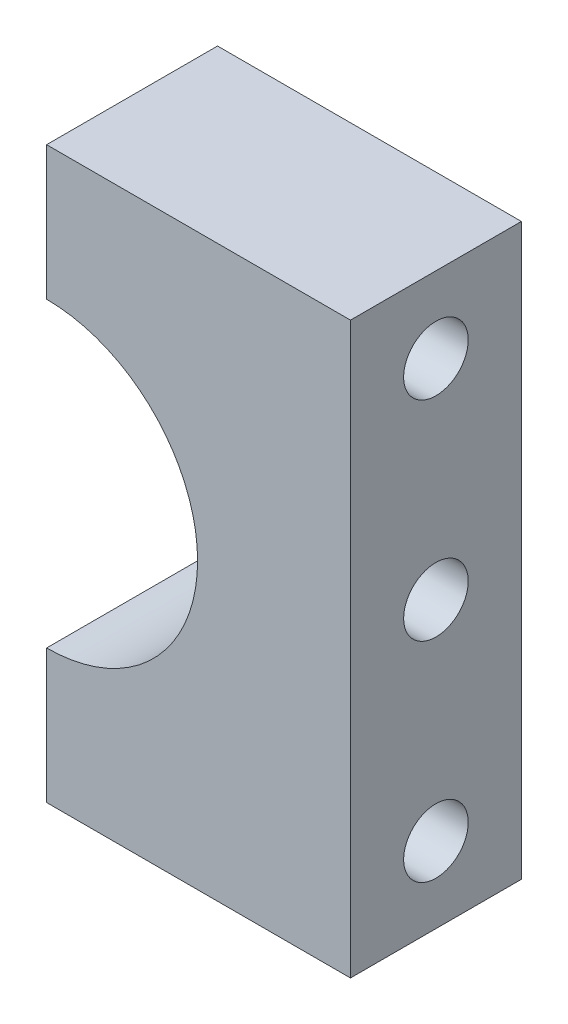
ISO-10303-21;
HEADER;
FILE_DESCRIPTION(('STEP AP214'),'2;1');
FILE_NAME('part.step','',(''),(''),'','','');
FILE_SCHEMA(('AUTOMOTIVE_DESIGN { 1 0 10303 214 1 1 1 1 }'));
ENDSEC;
DATA;
#1=APPLICATION_CONTEXT('core data for automotive mechanical design processes');
#2=APPLICATION_PROTOCOL_DEFINITION('international standard','automotive_design',2000,#1);
#3=PRODUCT_CONTEXT('',#1,'mechanical');
#4=PRODUCT('Part','Part','',(#3));
#5=PRODUCT_RELATED_PRODUCT_CATEGORY('part','',(#4));
#6=PRODUCT_DEFINITION_FORMATION('','',#4);
#7=PRODUCT_DEFINITION_CONTEXT('part definition',#1,'design');
#8=PRODUCT_DEFINITION('design','',#6,#7);
#9=PRODUCT_DEFINITION_SHAPE('','',#8);
#10=(LENGTH_UNIT() NAMED_UNIT(*) SI_UNIT(.MILLI.,.METRE.));
#11=(NAMED_UNIT(*) PLANE_ANGLE_UNIT() SI_UNIT($,.RADIAN.));
#12=(NAMED_UNIT(*) SI_UNIT($,.STERADIAN.) SOLID_ANGLE_UNIT());
#13=UNCERTAINTY_MEASURE_WITH_UNIT(LENGTH_MEASURE(1.E-05),#10,'distance_accuracy_value','');
#14=(GEOMETRIC_REPRESENTATION_CONTEXT(3) GLOBAL_UNCERTAINTY_ASSIGNED_CONTEXT((#13)) GLOBAL_UNIT_ASSIGNED_CONTEXT((#10,
#11,#12)) REPRESENTATION_CONTEXT('',''));
#15=CARTESIAN_POINT('',(0.,0.,0.));
#16=DIRECTION('',(0.,0.,1.));
#17=DIRECTION('',(1.,0.,0.));
#18=AXIS2_PLACEMENT_3D('',#15,#16,#17);
#19=CARTESIAN_POINT('',(31.5,12.,9.));
#20=DIRECTION('',(0.,0.,1.));
#21=DIRECTION('',(1.,0.,0.));
#22=AXIS2_PLACEMENT_3D('',#19,#20,#21);
#23=PLANE('',#22);
#24=DIRECTION('',(0.,1.,0.));
#25=VECTOR('',#24,1.);
#26=CARTESIAN_POINT('',(32.,8.,9.));
#27=LINE('',#26,#25);
#28=CARTESIAN_POINT('',(32.,0.,9.));
#29=VERTEX_POINT('',#28);
#30=CARTESIAN_POINT('',(32.,30.,9.));
#31=VERTEX_POINT('',#30);
#32=EDGE_CURVE('E123',#29,#31,#27,.T.);
#33=ORIENTED_EDGE('',*,*,#32,.T.);
#34=DIRECTION('',(-1.,0.,0.));
#35=VECTOR('',#34,1.);
#36=CARTESIAN_POINT('',(0.,30.,9.));
#37=LINE('',#36,#35);
#38=CARTESIAN_POINT('',(16.,30.,9.));
#39=VERTEX_POINT('',#38);
#40=EDGE_CURVE('E129',#31,#39,#37,.T.);
#41=ORIENTED_EDGE('',*,*,#40,.T.);
#42=DIRECTION('',(0.,1.,0.));
#43=VECTOR('',#42,1.);
#44=CARTESIAN_POINT('',(16.,12.,9.));
#45=LINE('',#44,#43);
#46=CARTESIAN_POINT('',(16.,22.95,9.));
#47=VERTEX_POINT('',#46);
#48=EDGE_CURVE('E100',#47,#39,#45,.T.);
#49=ORIENTED_EDGE('',*,*,#48,.F.);
#50=CARTESIAN_POINT('',(16.,15.,9.));
#51=DIRECTION('',(0.,0.,1.));
#52=DIRECTION('',(1.,0.,0.));
#53=AXIS2_PLACEMENT_3D('',#50,#51,#52);
#54=CIRCLE('',#53,7.95);
#55=CARTESIAN_POINT('',(16.,7.05,9.));
#56=VERTEX_POINT('',#55);
#57=EDGE_CURVE('E190',#56,#47,#54,.T.);
#58=ORIENTED_EDGE('',*,*,#57,.F.);
#59=CARTESIAN_POINT('',(16.,0.,9.));
#60=VERTEX_POINT('',#59);
#61=EDGE_CURVE('E68',#60,#56,#45,.T.);
#62=ORIENTED_EDGE('',*,*,#61,.F.);
#63=DIRECTION('',(1.,0.,0.));
#64=VECTOR('',#63,1.);
#65=CARTESIAN_POINT('',(0.,0.,9.));
#66=LINE('',#65,#64);
#67=EDGE_CURVE('E120',#60,#29,#66,.T.);
#68=ORIENTED_EDGE('',*,*,#67,.T.);
#69=EDGE_LOOP('',(#33,#41,#49,#58,#62,#68));
#70=FACE_BOUND('',#69,.T.);
#71=ADVANCED_FACE('F43',(#70),#23,.T.);
#72=CARTESIAN_POINT('',(31.5,12.,0.));
#73=DIRECTION('',(0.,0.,1.));
#74=DIRECTION('',(1.,0.,0.));
#75=AXIS2_PLACEMENT_3D('',#72,#73,#74);
#76=PLANE('',#75);
#77=DIRECTION('',(0.,1.,0.));
#78=VECTOR('',#77,1.);
#79=CARTESIAN_POINT('',(32.,30.,0.));
#80=LINE('',#79,#78);
#81=CARTESIAN_POINT('',(32.,0.,0.));
#82=VERTEX_POINT('',#81);
#83=CARTESIAN_POINT('',(32.,30.,0.));
#84=VERTEX_POINT('',#83);
#85=EDGE_CURVE('E121',#82,#84,#80,.T.);
#86=ORIENTED_EDGE('',*,*,#85,.F.);
#87=DIRECTION('',(1.,0.,0.));
#88=VECTOR('',#87,1.);
#89=CARTESIAN_POINT('',(0.,0.,0.));
#90=LINE('',#89,#88);
#91=CARTESIAN_POINT('',(16.,0.,0.));
#92=VERTEX_POINT('',#91);
#93=EDGE_CURVE('E125',#92,#82,#90,.T.);
#94=ORIENTED_EDGE('',*,*,#93,.F.);
#95=DIRECTION('',(0.,-1.,0.));
#96=VECTOR('',#95,1.);
#97=CARTESIAN_POINT('',(16.,30.,0.));
#98=LINE('',#97,#96);
#99=CARTESIAN_POINT('',(16.,7.05,0.));
#100=VERTEX_POINT('',#99);
#101=EDGE_CURVE('E115',#100,#92,#98,.T.);
#102=ORIENTED_EDGE('',*,*,#101,.F.);
#103=CARTESIAN_POINT('',(16.,15.,0.));
#104=DIRECTION('',(0.,0.,1.));
#105=DIRECTION('',(1.,0.,0.));
#106=AXIS2_PLACEMENT_3D('',#103,#104,#105);
#107=CIRCLE('',#106,7.95);
#108=CARTESIAN_POINT('',(16.,22.95,0.));
#109=VERTEX_POINT('',#108);
#110=EDGE_CURVE('E114',#100,#109,#107,.T.);
#111=ORIENTED_EDGE('',*,*,#110,.T.);
#112=CARTESIAN_POINT('',(16.,30.,0.));
#113=VERTEX_POINT('',#112);
#114=EDGE_CURVE('E60',#113,#109,#98,.T.);
#115=ORIENTED_EDGE('',*,*,#114,.F.);
#116=DIRECTION('',(-1.,0.,0.));
#117=VECTOR('',#116,1.);
#118=CARTESIAN_POINT('',(0.,30.,0.));
#119=LINE('',#118,#117);
#120=EDGE_CURVE('E111',#84,#113,#119,.T.);
#121=ORIENTED_EDGE('',*,*,#120,.F.);
#122=EDGE_LOOP('',(#86,#94,#102,#111,#115,#121));
#123=FACE_BOUND('',#122,.T.);
#124=ADVANCED_FACE('F110',(#123),#76,.F.);
#125=CARTESIAN_POINT('',(0.,0.,9.));
#126=DIRECTION('',(0.,1.,0.));
#127=DIRECTION('',(-1.,0.,0.));
#128=AXIS2_PLACEMENT_3D('',#125,#126,#127);
#129=PLANE('',#128);
#130=ORIENTED_EDGE('',*,*,#67,.F.);
#131=DIRECTION('',(0.,0.,-1.));
#132=VECTOR('',#131,1.);
#133=CARTESIAN_POINT('',(16.,0.,10.));
#134=LINE('',#133,#132);
#135=EDGE_CURVE('E105',#60,#92,#134,.T.);
#136=ORIENTED_EDGE('',*,*,#135,.T.);
#137=ORIENTED_EDGE('',*,*,#93,.T.);
#138=DIRECTION('',(0.,0.,-1.));
#139=VECTOR('',#138,1.);
#140=CARTESIAN_POINT('',(32.,0.,9.));
#141=LINE('',#140,#139);
#142=EDGE_CURVE('E11',#29,#82,#141,.T.);
#143=ORIENTED_EDGE('',*,*,#142,.F.);
#144=EDGE_LOOP('',(#130,#136,#137,#143));
#145=FACE_BOUND('',#144,.T.);
#146=ADVANCED_FACE('F45',(#145),#129,.F.);
#147=CARTESIAN_POINT('',(32.,30.,9.));
#148=DIRECTION('',(-1.,0.,0.));
#149=DIRECTION('',(0.,0.,1.));
#150=AXIS2_PLACEMENT_3D('',#147,#148,#149);
#151=PLANE('',#150);
#152=CARTESIAN_POINT('',(32.,15.,4.5));
#153=DIRECTION('',(-1.,0.,0.));
#154=DIRECTION('',(0.,0.,1.));
#155=AXIS2_PLACEMENT_3D('',#152,#153,#154);
#156=CIRCLE('',#155,1.7);
#157=CARTESIAN_POINT('',(32.,15.,6.2));
#158=VERTEX_POINT('',#157);
#159=EDGE_CURVE('E47',#158,#158,#156,.T.);
#160=ORIENTED_EDGE('',*,*,#159,.T.);
#161=EDGE_LOOP('',(#160));
#162=FACE_BOUND('',#161,.T.);
#163=CARTESIAN_POINT('',(32.,26.,4.5));
#164=DIRECTION('',(1.,0.,0.));
#165=DIRECTION('',(0.,0.,-1.));
#166=AXIS2_PLACEMENT_3D('',#163,#164,#165);
#167=CIRCLE('',#166,1.7);
#168=CARTESIAN_POINT('',(32.,26.,2.8));
#169=VERTEX_POINT('',#168);
#170=EDGE_CURVE('E138',#169,#169,#167,.T.);
#171=ORIENTED_EDGE('',*,*,#170,.F.);
#172=EDGE_LOOP('',(#171));
#173=FACE_BOUND('',#172,.T.);
#174=ORIENTED_EDGE('',*,*,#85,.T.);
#175=DIRECTION('',(0.,0.,-1.));
#176=VECTOR('',#175,1.);
#177=CARTESIAN_POINT('',(32.,30.,9.));
#178=LINE('',#177,#176);
#179=EDGE_CURVE('E52',#31,#84,#178,.T.);
#180=ORIENTED_EDGE('',*,*,#179,.F.);
#181=ORIENTED_EDGE('',*,*,#32,.F.);
#182=ORIENTED_EDGE('',*,*,#142,.T.);
#183=EDGE_LOOP('',(#174,#180,#181,#182));
#184=FACE_BOUND('',#183,.T.);
#185=CARTESIAN_POINT('',(32.,4.,4.5));
#186=DIRECTION('',(1.,0.,0.));
#187=DIRECTION('',(0.,0.,-1.));
#188=AXIS2_PLACEMENT_3D('',#185,#186,#187);
#189=CIRCLE('',#188,1.7);
#190=CARTESIAN_POINT('',(32.,4.,2.8));
#191=VERTEX_POINT('',#190);
#192=EDGE_CURVE('E187',#191,#191,#189,.T.);
#193=ORIENTED_EDGE('',*,*,#192,.F.);
#194=EDGE_LOOP('',(#193));
#195=FACE_BOUND('',#194,.T.);
#196=ADVANCED_FACE('F171',(#162,#173,#184,#195),#151,.F.);
#197=CARTESIAN_POINT('',(0.,30.,9.));
#198=DIRECTION('',(0.,-1.,0.));
#199=DIRECTION('',(0.,0.,-1.));
#200=AXIS2_PLACEMENT_3D('',#197,#198,#199);
#201=PLANE('',#200);
#202=ORIENTED_EDGE('',*,*,#120,.T.);
#203=DIRECTION('',(0.,0.,-1.));
#204=VECTOR('',#203,1.);
#205=CARTESIAN_POINT('',(16.,30.,10.));
#206=LINE('',#205,#204);
#207=EDGE_CURVE('E96',#39,#113,#206,.T.);
#208=ORIENTED_EDGE('',*,*,#207,.F.);
#209=ORIENTED_EDGE('',*,*,#40,.F.);
#210=ORIENTED_EDGE('',*,*,#179,.T.);
#211=EDGE_LOOP('',(#202,#208,#209,#210));
#212=FACE_BOUND('',#211,.T.);
#213=ADVANCED_FACE('F118',(#212),#201,.F.);
#214=CARTESIAN_POINT('',(16.,15.,9.));
#215=DIRECTION('',(0.,0.,-1.));
#216=DIRECTION('',(-1.,0.,0.));
#217=AXIS2_PLACEMENT_3D('',#214,#215,#216);
#218=CYLINDRICAL_SURFACE('',#217,7.95);
#219=DIRECTION('',(0.,0.,-1.));
#220=VECTOR('',#219,1.);
#221=CARTESIAN_POINT('',(16.,7.05,9.));
#222=LINE('',#221,#220);
#223=EDGE_CURVE('E194',#56,#100,#222,.T.);
#224=ORIENTED_EDGE('',*,*,#223,.F.);
#225=ORIENTED_EDGE('',*,*,#57,.T.);
#226=DIRECTION('',(0.,0.,-1.));
#227=VECTOR('',#226,1.);
#228=CARTESIAN_POINT('',(16.,22.95,9.));
#229=LINE('',#228,#227);
#230=EDGE_CURVE('E208',#109,#47,#229,.F.);
#231=ORIENTED_EDGE('',*,*,#230,.F.);
#232=ORIENTED_EDGE('',*,*,#110,.F.);
#233=EDGE_LOOP('',(#224,#225,#231,#232));
#234=FACE_BOUND('',#233,.T.);
#235=CARTESIAN_POINT('',(23.7661122835045,13.3,4.5));
#236=CARTESIAN_POINT('',(23.7661141872229,13.3000033129941,4.5943109642859));
#237=CARTESIAN_POINT('',(23.7678489419856,13.3078748219172,4.68866224997616));
#238=CARTESIAN_POINT('',(23.7745884659118,13.3391206437132,4.87468543010844));
#239=CARTESIAN_POINT('',(23.7795956669418,13.3625064860114,4.96635527891183));
#240=CARTESIAN_POINT('',(23.7922876489716,13.4240140896177,5.14429768292524));
#241=CARTESIAN_POINT('',(23.7999695654145,13.4621200907434,5.23057589631724));
#242=CARTESIAN_POINT('',(23.817141984316,13.551941724182,5.39551547711853));
#243=CARTESIAN_POINT('',(23.8266324324992,13.6036569480899,5.47417707300121));
#244=CARTESIAN_POINT('',(23.8465238206736,13.7201193105937,5.62292290460992));
#245=CARTESIAN_POINT('',(23.8569359681267,13.7850445514897,5.69286621808963));
#246=CARTESIAN_POINT('',(23.877399311524,13.9256993882072,5.82095690426707));
#247=CARTESIAN_POINT('',(23.8874504801263,14.001429800299,5.87910338497535));
#248=CARTESIAN_POINT('',(23.9061811137769,14.1624869983143,5.9825044411356));
#249=CARTESIAN_POINT('',(23.9148458148636,14.2479023896894,6.02762390927777));
#250=CARTESIAN_POINT('',(23.929700826949,14.4253189099216,6.10281667964285));
#251=CARTESIAN_POINT('',(23.9358914031206,14.5173193317579,6.13289159440613));
#252=CARTESIAN_POINT('',(23.945021461709,14.7038298020327,6.17669953228088));
#253=CARTESIAN_POINT('',(23.9480083183567,14.7982815047663,6.19067092045913));
#254=CARTESIAN_POINT('',(23.9505583976698,14.9882322496347,6.20262005194222));
#255=CARTESIAN_POINT('',(23.9501219953826,15.0837311758922,6.20059954729629));
#256=CARTESIAN_POINT('',(23.9459110689087,15.2714237107685,6.18080065608652));
#257=CARTESIAN_POINT('',(23.9421909640677,15.3636458166694,6.16327915009655));
#258=CARTESIAN_POINT('',(23.9318924561479,15.5438097301951,6.11338446257168));
#259=CARTESIAN_POINT('',(23.9253139276535,15.6317513498222,6.08101062937617));
#260=CARTESIAN_POINT('',(23.9099496370436,15.8015763523485,6.00210016085132));
#261=CARTESIAN_POINT('',(23.9011486393898,15.8834126485471,5.95546527703628));
#262=CARTESIAN_POINT('',(23.8823058403426,16.0381920690372,5.84942960691174));
#263=CARTESIAN_POINT('',(23.8722638769955,16.1111340300909,5.79002715360728));
#264=CARTESIAN_POINT('',(23.8518089034424,16.2475811659534,5.6587411198786));
#265=CARTESIAN_POINT('',(23.8413924860665,16.3108696868057,5.58663270853256));
#266=CARTESIAN_POINT('',(23.8215504221431,16.4244949066272,5.43271880643315));
#267=CARTESIAN_POINT('',(23.8121248001113,16.4748312851615,5.35091307584214));
#268=CARTESIAN_POINT('',(23.7953231174405,16.5612137684422,5.17958700288325));
#269=CARTESIAN_POINT('',(23.787952717816,16.597220517038,5.0900462250085));
#270=CARTESIAN_POINT('',(23.7761755571917,16.6536118471267,4.90599039132229));
#271=CARTESIAN_POINT('',(23.7717683489746,16.6739987860924,4.81147608845906));
#272=CARTESIAN_POINT('',(23.7665073597396,16.698239045832,4.62213146348638));
#273=CARTESIAN_POINT('',(23.7655859389165,16.7024071308708,4.5273432710068));
#274=CARTESIAN_POINT('',(23.7672186316109,16.6949421602401,4.3384263511766));
#275=CARTESIAN_POINT('',(23.7697725177244,16.6833101384381,4.24429758108228));
#276=CARTESIAN_POINT('',(23.7780043345222,16.6448477838284,4.06045719752228));
#277=CARTESIAN_POINT('',(23.7836468967096,16.618189417141,3.97070787674854));
#278=CARTESIAN_POINT('',(23.7973886260018,16.5506166750185,3.79694965839947));
#279=CARTESIAN_POINT('',(23.8054880196023,16.5097009851468,3.71294129095886));
#280=CARTESIAN_POINT('',(23.8233803245948,16.4140764565133,3.55168342787885));
#281=CARTESIAN_POINT('',(23.8331964736278,16.3591728941945,3.47455203210251));
#282=CARTESIAN_POINT('',(23.8533543159628,16.2373872007273,3.33048198321197));
#283=CARTESIAN_POINT('',(23.8636960713997,16.1705036509874,3.26354453893736));
#284=CARTESIAN_POINT('',(23.8839619155484,16.0252352264966,3.14054839011173));
#285=CARTESIAN_POINT('',(23.8938753360673,15.9466673186512,3.08470381033189));
#286=CARTESIAN_POINT('',(23.9119742332038,15.7810824887388,2.98700648350742));
#287=CARTESIAN_POINT('',(23.9201597885231,15.6940659517579,2.94515309913411));
#288=CARTESIAN_POINT('',(23.9338355232488,15.5145833219385,2.87692819313777));
#289=CARTESIAN_POINT('',(23.9393422965235,15.4221548581953,2.85046115527808));
#290=CARTESIAN_POINT('',(23.9471116001215,15.2340330667252,2.81346069695955));
#291=CARTESIAN_POINT('',(23.9493745801283,15.1383401934234,2.80292506793601));
#292=CARTESIAN_POINT('',(23.9503886997825,14.9484419851733,2.79818210875684));
#293=CARTESIAN_POINT('',(23.9492087260198,14.8542448738561,2.80365449594761));
#294=CARTESIAN_POINT('',(23.9436163686276,14.6681459645559,2.83005830763286));
#295=CARTESIAN_POINT('',(23.9392040381796,14.5762441288348,2.85098947778661));
#296=CARTESIAN_POINT('',(23.9276469967434,14.3975793459462,2.90756612109258));
#297=CARTESIAN_POINT('',(23.9205103813584,14.3108020443623,2.94316802274452));
#298=CARTESIAN_POINT('',(23.9042685262305,14.1444091254304,3.02803230238845));
#299=CARTESIAN_POINT('',(23.8951631046538,14.0647941705408,3.07729594226213));
#300=CARTESIAN_POINT('',(23.8757714023852,13.9134177712811,3.18913936409738));
#301=CARTESIAN_POINT('',(23.8654666263221,13.8418258833761,3.25194545060346));
#302=CARTESIAN_POINT('',(23.8449399332437,13.7100879787366,3.38863210693912));
#303=CARTESIAN_POINT('',(23.8347180366844,13.6499447100315,3.4625153280415));
#304=CARTESIAN_POINT('',(23.8153707606138,13.5420806944262,3.62038265628356));
#305=CARTESIAN_POINT('',(23.8062608918763,13.4945267588879,3.70448274155578));
#306=CARTESIAN_POINT('',(23.790362556418,13.4143024293156,3.87965602416482));
#307=CARTESIAN_POINT('',(23.7835720878836,13.3816191926377,3.97072312492864));
#308=CARTESIAN_POINT('',(23.7743640324293,13.3380354783044,4.1349290023104));
#309=CARTESIAN_POINT('',(23.7712897915581,13.32379902437,4.20716405921238));
#310=CARTESIAN_POINT('',(23.767163219817,13.3047802039907,4.35292460812472));
#311=CARTESIAN_POINT('',(23.7661107988585,13.299997416307,4.42645004249084));
#312=CARTESIAN_POINT('',(23.7661122835045,13.3,4.5));
#313=B_SPLINE_CURVE_WITH_KNOTS('',3,(#235,#236,#237,#238,#239,#240,#241,#242,#243,#244,#245,
#246,#247,#248,#249,#250,#251,#252,#253,#254,#255,#256,#257,#258,#259,#260,#261,#262,#263,#264,
#265,#266,#267,#268,#269,#270,#271,#272,#273,#274,#275,#276,#277,#278,#279,#280,#281,#282,#283,
#284,#285,#286,#287,#288,#289,#290,#291,#292,#293,#294,#295,#296,#297,#298,#299,#300,#301,#302,
#303,#304,#305,#306,#307,#308,#309,#310,#311,#312),.UNSPECIFIED.,.T.,.F.,(4,2,2,2,2,2,2,2,2,2,2,
2,2,2,2,2,2,2,2,2,2,2,2,2,2,2,2,2,2,2,2,2,2,2,2,2,2,2,4),(0.,0.282663408166271,
0.565537112366904,0.848108792655945,1.13067199409935,1.41733267223707,1.70401501746845,
1.99357180597698,2.28309755188179,2.56828034506872,2.8534318944632,3.13394465920556,
3.41446973290136,3.69697270875964,3.97951259198858,4.26767447313142,4.55584348268647,
4.84479857142277,5.13371004003603,5.41698570023714,5.70024282541303,5.98032223194158,
6.26042746688797,6.54466817847692,6.82894257026549,7.11826149555369,7.40756723995364,
7.69505729000225,7.98250748176797,8.26424605630019,8.54597999553865,8.82688315852989,
9.10781227610188,9.39386085874022,9.67997801571251,9.96971542029072,10.2592021244673,
10.4796516579891,10.7000913684453),.UNSPECIFIED.);
#314=CARTESIAN_POINT('',(23.7661122835045,13.3,4.5));
#315=VERTEX_POINT('',#314);
#316=EDGE_CURVE('E131',#315,#315,#313,.T.);
#317=ORIENTED_EDGE('',*,*,#316,.F.);
#318=EDGE_LOOP('',(#317));
#319=FACE_BOUND('',#318,.T.);
#320=ADVANCED_FACE('F140',(#234,#319),#218,.F.);
#321=CARTESIAN_POINT('',(-18.,26.,4.5));
#322=DIRECTION('',(1.,0.,0.));
#323=DIRECTION('',(0.,0.,-1.));
#324=AXIS2_PLACEMENT_3D('',#321,#322,#323);
#325=CYLINDRICAL_SURFACE('',#324,1.7);
#326=CARTESIAN_POINT('',(16.,26.,4.5));
#327=DIRECTION('',(1.,0.,0.));
#328=DIRECTION('',(0.,1.,0.));
#329=AXIS2_PLACEMENT_3D('',#326,#327,#328);
#330=CIRCLE('',#329,1.7);
#331=CARTESIAN_POINT('',(16.,27.7,4.5));
#332=VERTEX_POINT('',#331);
#333=EDGE_CURVE('E209',#332,#332,#330,.F.);
#334=ORIENTED_EDGE('',*,*,#333,.T.);
#335=EDGE_LOOP('',(#334));
#336=FACE_BOUND('',#335,.T.);
#337=ORIENTED_EDGE('',*,*,#170,.T.);
#338=EDGE_LOOP('',(#337));
#339=FACE_BOUND('',#338,.T.);
#340=ADVANCED_FACE('F153',(#336,#339),#325,.F.);
#341=CARTESIAN_POINT('',(-18.,4.,4.5));
#342=DIRECTION('',(1.,0.,0.));
#343=DIRECTION('',(0.,0.,-1.));
#344=AXIS2_PLACEMENT_3D('',#341,#342,#343);
#345=CYLINDRICAL_SURFACE('',#344,1.7);
#346=CARTESIAN_POINT('',(16.,4.,4.5));
#347=DIRECTION('',(1.,0.,0.));
#348=DIRECTION('',(0.,1.,0.));
#349=AXIS2_PLACEMENT_3D('',#346,#347,#348);
#350=CIRCLE('',#349,1.7);
#351=CARTESIAN_POINT('',(16.,5.7,4.5));
#352=VERTEX_POINT('',#351);
#353=EDGE_CURVE('E139',#352,#352,#350,.F.);
#354=ORIENTED_EDGE('',*,*,#353,.T.);
#355=EDGE_LOOP('',(#354));
#356=FACE_BOUND('',#355,.T.);
#357=ORIENTED_EDGE('',*,*,#192,.T.);
#358=EDGE_LOOP('',(#357));
#359=FACE_BOUND('',#358,.T.);
#360=ADVANCED_FACE('F150',(#356,#359),#345,.F.);
#361=CARTESIAN_POINT('',(33.5,15.,4.5));
#362=DIRECTION('',(-1.,0.,0.));
#363=DIRECTION('',(0.,-1.,0.));
#364=AXIS2_PLACEMENT_3D('',#361,#362,#363);
#365=CYLINDRICAL_SURFACE('',#364,1.7);
#366=ORIENTED_EDGE('',*,*,#316,.T.);
#367=EDGE_LOOP('',(#366));
#368=FACE_BOUND('',#367,.T.);
#369=ORIENTED_EDGE('',*,*,#159,.F.);
#370=EDGE_LOOP('',(#369));
#371=FACE_BOUND('',#370,.T.);
#372=ADVANCED_FACE('F144',(#368,#371),#365,.F.);
#373=CARTESIAN_POINT('',(16.,30.,10.));
#374=DIRECTION('',(1.,0.,0.));
#375=DIRECTION('',(0.,1.,0.));
#376=AXIS2_PLACEMENT_3D('',#373,#374,#375);
#377=PLANE('',#376);
#378=ORIENTED_EDGE('',*,*,#61,.T.);
#379=ORIENTED_EDGE('',*,*,#223,.T.);
#380=ORIENTED_EDGE('',*,*,#101,.T.);
#381=ORIENTED_EDGE('',*,*,#135,.F.);
#382=EDGE_LOOP('',(#378,#379,#380,#381));
#383=FACE_BOUND('',#382,.T.);
#384=ORIENTED_EDGE('',*,*,#353,.F.);
#385=EDGE_LOOP('',(#384));
#386=FACE_BOUND('',#385,.T.);
#387=ADVANCED_FACE('F149',(#383,#386),#377,.F.);
#388=ORIENTED_EDGE('',*,*,#48,.T.);
#389=ORIENTED_EDGE('',*,*,#207,.T.);
#390=ORIENTED_EDGE('',*,*,#114,.T.);
#391=ORIENTED_EDGE('',*,*,#230,.T.);
#392=EDGE_LOOP('',(#388,#389,#390,#391));
#393=FACE_BOUND('',#392,.T.);
#394=ORIENTED_EDGE('',*,*,#333,.F.);
#395=EDGE_LOOP('',(#394));
#396=FACE_BOUND('',#395,.T.);
#397=ADVANCED_FACE('F97',(#393,#396),#377,.F.);
#398=CLOSED_SHELL('',(#71,#124,#146,#196,#213,#320,#340,#360,#372,#387,#397));
#399=MANIFOLD_SOLID_BREP('B2',#398);
#400=ADVANCED_BREP_SHAPE_REPRESENTATION('',(#18,#399),#14);
#401=SHAPE_DEFINITION_REPRESENTATION(#9,#400);
ENDSEC;
END-ISO-10303-21;
